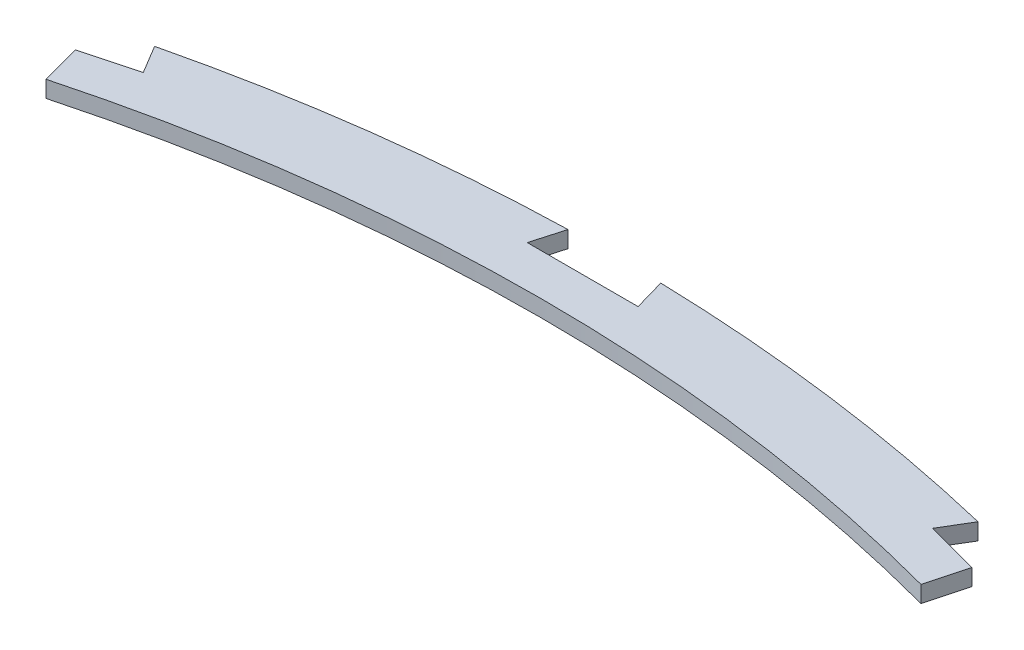
ISO-10303-21;
HEADER;
FILE_DESCRIPTION(('STEP AP214'),'2;1');
FILE_NAME('part.step','',(''),(''),'','','');
FILE_SCHEMA(('AUTOMOTIVE_DESIGN { 1 0 10303 214 1 1 1 1 }'));
ENDSEC;
DATA;
#1=APPLICATION_CONTEXT('core data for automotive mechanical design processes');
#2=APPLICATION_PROTOCOL_DEFINITION('international standard','automotive_design',2000,#1);
#3=PRODUCT_CONTEXT('',#1,'mechanical');
#4=PRODUCT('Part','Part','',(#3));
#5=PRODUCT_RELATED_PRODUCT_CATEGORY('part','',(#4));
#6=PRODUCT_DEFINITION_FORMATION('','',#4);
#7=PRODUCT_DEFINITION_CONTEXT('part definition',#1,'design');
#8=PRODUCT_DEFINITION('design','',#6,#7);
#9=PRODUCT_DEFINITION_SHAPE('','',#8);
#10=(LENGTH_UNIT() NAMED_UNIT(*) SI_UNIT(.MILLI.,.METRE.));
#11=(NAMED_UNIT(*) PLANE_ANGLE_UNIT() SI_UNIT($,.RADIAN.));
#12=(NAMED_UNIT(*) SI_UNIT($,.STERADIAN.) SOLID_ANGLE_UNIT());
#13=UNCERTAINTY_MEASURE_WITH_UNIT(LENGTH_MEASURE(1.E-05),#10,'distance_accuracy_value','');
#14=(GEOMETRIC_REPRESENTATION_CONTEXT(3) GLOBAL_UNCERTAINTY_ASSIGNED_CONTEXT((#13)) GLOBAL_UNIT_ASSIGNED_CONTEXT((#10,
#11,#12)) REPRESENTATION_CONTEXT('',''));
#15=CARTESIAN_POINT('',(0.,0.,0.));
#16=DIRECTION('',(0.,0.,1.));
#17=DIRECTION('',(1.,0.,0.));
#18=AXIS2_PLACEMENT_3D('',#15,#16,#17);
#19=CARTESIAN_POINT('',(0.,9.00000000000001,0.));
#20=DIRECTION('',(0.,-1.,0.));
#21=DIRECTION('',(0.,0.,-1.));
#22=AXIS2_PLACEMENT_3D('',#19,#20,#21);
#23=CYLINDRICAL_SURFACE('',#22,915.);
#24=CARTESIAN_POINT('',(0.,0.,0.));
#25=DIRECTION('',(0.,1.,0.));
#26=DIRECTION('',(0.,0.,1.));
#27=AXIS2_PLACEMENT_3D('',#24,#25,#26);
#28=CIRCLE('',#27,915.);
#29=CARTESIAN_POINT('',(236.819426268801,0.,-883.822131054499));
#30=VERTEX_POINT('',#29);
#31=CARTESIAN_POINT('',(-236.819426268801,0.,-883.822131054499));
#32=VERTEX_POINT('',#31);
#33=EDGE_CURVE('E172',#30,#32,#28,.T.);
#34=ORIENTED_EDGE('',*,*,#33,.F.);
#35=DIRECTION('',(0.,-1.,0.));
#36=VECTOR('',#35,1.);
#37=CARTESIAN_POINT('',(236.819426268801,9.00000000000001,-883.822131054499));
#38=LINE('',#37,#36);
#39=CARTESIAN_POINT('',(236.819426268801,9.00000000000001,-883.822131054499));
#40=VERTEX_POINT('',#39);
#41=EDGE_CURVE('E11',#40,#30,#38,.T.);
#42=ORIENTED_EDGE('',*,*,#41,.F.);
#43=CARTESIAN_POINT('',(0.,9.00000000000001,0.));
#44=DIRECTION('',(0.,1.,0.));
#45=DIRECTION('',(0.,0.,1.));
#46=AXIS2_PLACEMENT_3D('',#43,#44,#45);
#47=CIRCLE('',#46,915.);
#48=CARTESIAN_POINT('',(-236.819426268801,9.00000000000001,-883.822131054499));
#49=VERTEX_POINT('',#48);
#50=EDGE_CURVE('E209',#40,#49,#47,.T.);
#51=ORIENTED_EDGE('',*,*,#50,.T.);
#52=DIRECTION('',(0.,-1.,0.));
#53=VECTOR('',#52,1.);
#54=CARTESIAN_POINT('',(-236.819426268801,9.00000000000001,-883.822131054499));
#55=LINE('',#54,#53);
#56=EDGE_CURVE('E66',#49,#32,#55,.T.);
#57=ORIENTED_EDGE('',*,*,#56,.T.);
#58=EDGE_LOOP('',(#34,#42,#51,#57));
#59=FACE_BOUND('',#58,.T.);
#60=ADVANCED_FACE('F49',(#59),#23,.F.);
#61=CARTESIAN_POINT('',(0.,9.00000000000001,0.));
#62=DIRECTION('',(-0.96592582628907,0.,-0.258819045102515));
#63=DIRECTION('',(-0.258819045102515,0.,0.96592582628907));
#64=AXIS2_PLACEMENT_3D('',#61,#62,#63);
#65=PLANE('',#64);
#66=DIRECTION('',(0.258819045102515,0.,-0.96592582628907));
#67=VECTOR('',#66,1.);
#68=CARTESIAN_POINT('',(0.,0.,0.));
#69=LINE('',#68,#67);
#70=CARTESIAN_POINT('',(242.642854783607,0.,-905.555462146003));
#71=VERTEX_POINT('',#70);
#72=EDGE_CURVE('E175',#30,#71,#69,.T.);
#73=ORIENTED_EDGE('',*,*,#72,.T.);
#74=DIRECTION('',(0.,-1.,0.));
#75=VECTOR('',#74,1.);
#76=CARTESIAN_POINT('',(242.642854783607,9.00000000000001,-905.555462146003));
#77=LINE('',#76,#75);
#78=CARTESIAN_POINT('',(242.642854783607,9.00000000000001,-905.555462146003));
#79=VERTEX_POINT('',#78);
#80=EDGE_CURVE('E58',#79,#71,#77,.T.);
#81=ORIENTED_EDGE('',*,*,#80,.F.);
#82=DIRECTION('',(0.258819045102515,0.,-0.96592582628907));
#83=VECTOR('',#82,1.);
#84=CARTESIAN_POINT('',(0.,9.00000000000001,0.));
#85=LINE('',#84,#83);
#86=EDGE_CURVE('E438',#40,#79,#85,.T.);
#87=ORIENTED_EDGE('',*,*,#86,.F.);
#88=ORIENTED_EDGE('',*,*,#41,.T.);
#89=EDGE_LOOP('',(#73,#81,#87,#88));
#90=FACE_BOUND('',#89,.T.);
#91=ADVANCED_FACE('F310',(#90),#65,.F.);
#92=CARTESIAN_POINT('',(242.642854783606,9.00000000000001,-905.555462146003));
#93=DIRECTION('',(-0.258819045102514,0.,0.96592582628907));
#94=DIRECTION('',(0.96592582628907,0.,0.258819045102514));
#95=AXIS2_PLACEMENT_3D('',#92,#93,#94);
#96=PLANE('',#95);
#97=DIRECTION('',(-0.96592582628907,0.,-0.258819045102514));
#98=VECTOR('',#97,1.);
#99=CARTESIAN_POINT('',(242.642854783606,0.,-905.555462146003));
#100=LINE('',#99,#98);
#101=CARTESIAN_POINT('',(213.665079994935,0.,-913.320033499078));
#102=VERTEX_POINT('',#101);
#103=EDGE_CURVE('E178',#71,#102,#100,.T.);
#104=ORIENTED_EDGE('',*,*,#103,.T.);
#105=DIRECTION('',(0.,-1.,0.));
#106=VECTOR('',#105,1.);
#107=CARTESIAN_POINT('',(213.665079994935,9.00000000000001,-913.320033499078));
#108=LINE('',#107,#106);
#109=CARTESIAN_POINT('',(213.665079994935,9.00000000000001,-913.320033499078));
#110=VERTEX_POINT('',#109);
#111=EDGE_CURVE('E233',#110,#102,#108,.T.);
#112=ORIENTED_EDGE('',*,*,#111,.F.);
#113=DIRECTION('',(-0.96592582628907,0.,-0.258819045102514));
#114=VECTOR('',#113,1.);
#115=CARTESIAN_POINT('',(242.642854783606,9.00000000000001,-905.555462146003));
#116=LINE('',#115,#114);
#117=EDGE_CURVE('E245',#79,#110,#116,.T.);
#118=ORIENTED_EDGE('',*,*,#117,.F.);
#119=ORIENTED_EDGE('',*,*,#80,.T.);
#120=EDGE_LOOP('',(#104,#112,#118,#119));
#121=FACE_BOUND('',#120,.T.);
#122=ADVANCED_FACE('F243',(#121),#96,.F.);
#123=CARTESIAN_POINT('',(-245.630415407765,9.00000000000001,-147.271219979183));
#124=DIRECTION('',(-0.857657753629804,0.,-0.51422094243494));
#125=DIRECTION('',(-0.51422094243494,0.,0.857657753629804));
#126=AXIS2_PLACEMENT_3D('',#123,#124,#125);
#127=PLANE('',#126);
#128=DIRECTION('',(0.51422094243494,0.,-0.857657753629804));
#129=VECTOR('',#128,1.);
#130=CARTESIAN_POINT('',(-245.630415407765,0.,-147.271219979183));
#131=LINE('',#130,#129);
#132=CARTESIAN_POINT('',(222.847691179681,0.,-928.63550790172));
#133=VERTEX_POINT('',#132);
#134=EDGE_CURVE('E181',#102,#133,#131,.T.);
#135=ORIENTED_EDGE('',*,*,#134,.T.);
#136=DIRECTION('',(0.,-1.,0.));
#137=VECTOR('',#136,1.);
#138=CARTESIAN_POINT('',(222.847691179681,9.00000000000001,-928.63550790172));
#139=LINE('',#138,#137);
#140=CARTESIAN_POINT('',(222.847691179681,9.00000000000001,-928.63550790172));
#141=VERTEX_POINT('',#140);
#142=EDGE_CURVE('E229',#141,#133,#139,.T.);
#143=ORIENTED_EDGE('',*,*,#142,.F.);
#144=DIRECTION('',(0.51422094243494,0.,-0.857657753629804));
#145=VECTOR('',#144,1.);
#146=CARTESIAN_POINT('',(-245.630415407765,9.00000000000001,-147.271219979183));
#147=LINE('',#146,#145);
#148=EDGE_CURVE('E265',#110,#141,#147,.T.);
#149=ORIENTED_EDGE('',*,*,#148,.F.);
#150=ORIENTED_EDGE('',*,*,#111,.T.);
#151=EDGE_LOOP('',(#135,#143,#149,#150));
#152=FACE_BOUND('',#151,.T.);
#153=ADVANCED_FACE('F254',(#152),#127,.F.);
#154=CARTESIAN_POINT('',(0.,9.00000000000001,0.));
#155=DIRECTION('',(0.,-1.,0.));
#156=DIRECTION('',(0.,0.,-1.));
#157=AXIS2_PLACEMENT_3D('',#154,#155,#156);
#158=CYLINDRICAL_SURFACE('',#157,955.);
#159=CARTESIAN_POINT('',(0.,0.,0.));
#160=DIRECTION('',(0.,1.,0.));
#161=DIRECTION('',(0.,0.,1.));
#162=AXIS2_PLACEMENT_3D('',#159,#160,#161);
#163=CIRCLE('',#162,955.);
#164=CARTESIAN_POINT('',(25.0942151640675,0.,-954.670246925764));
#165=VERTEX_POINT('',#164);
#166=EDGE_CURVE('E184',#133,#165,#163,.T.);
#167=ORIENTED_EDGE('',*,*,#166,.T.);
#168=DIRECTION('',(0.,-1.,0.));
#169=VECTOR('',#168,1.);
#170=CARTESIAN_POINT('',(25.0942151640675,9.00000000000001,-954.670246925764));
#171=LINE('',#170,#169);
#172=CARTESIAN_POINT('',(25.0942151640675,9.00000000000001,-954.670246925764));
#173=VERTEX_POINT('',#172);
#174=EDGE_CURVE('E226',#173,#165,#171,.T.);
#175=ORIENTED_EDGE('',*,*,#174,.F.);
#176=CARTESIAN_POINT('',(0.,9.00000000000001,0.));
#177=DIRECTION('',(0.,1.,0.));
#178=DIRECTION('',(0.,0.,1.));
#179=AXIS2_PLACEMENT_3D('',#176,#177,#178);
#180=CIRCLE('',#179,955.);
#181=EDGE_CURVE('E260',#141,#173,#180,.T.);
#182=ORIENTED_EDGE('',*,*,#181,.F.);
#183=ORIENTED_EDGE('',*,*,#142,.T.);
#184=EDGE_LOOP('',(#167,#175,#182,#183));
#185=FACE_BOUND('',#184,.T.);
#186=ADVANCED_FACE('F258',(#185),#158,.T.);
#187=CARTESIAN_POINT('',(275.377358490566,9.00000000000001,-78.6792452830185));
#188=DIRECTION('',(-0.961523947640823,0.,0.274721127897378));
#189=DIRECTION('',(0.274721127897378,0.,0.961523947640823));
#190=AXIS2_PLACEMENT_3D('',#187,#188,#189);
#191=PLANE('',#190);
#192=DIRECTION('',(-0.274721127897378,0.,-0.961523947640823));
#193=VECTOR('',#192,1.);
#194=CARTESIAN_POINT('',(275.377358490566,0.,-78.6792452830185));
#195=LINE('',#194,#193);
#196=CARTESIAN_POINT('',(30.,0.,-937.5));
#197=VERTEX_POINT('',#196);
#198=EDGE_CURVE('E188',#197,#165,#195,.T.);
#199=ORIENTED_EDGE('',*,*,#198,.F.);
#200=DIRECTION('',(0.,-1.,0.));
#201=VECTOR('',#200,1.);
#202=CARTESIAN_POINT('',(30.,9.00000000000001,-937.5));
#203=LINE('',#202,#201);
#204=CARTESIAN_POINT('',(30.,9.00000000000001,-937.5));
#205=VERTEX_POINT('',#204);
#206=EDGE_CURVE('E223',#205,#197,#203,.T.);
#207=ORIENTED_EDGE('',*,*,#206,.F.);
#208=DIRECTION('',(-0.274721127897378,0.,-0.961523947640823));
#209=VECTOR('',#208,1.);
#210=CARTESIAN_POINT('',(275.377358490566,9.00000000000001,-78.6792452830185));
#211=LINE('',#210,#209);
#212=EDGE_CURVE('E264',#205,#173,#211,.T.);
#213=ORIENTED_EDGE('',*,*,#212,.T.);
#214=ORIENTED_EDGE('',*,*,#174,.T.);
#215=EDGE_LOOP('',(#199,#207,#213,#214));
#216=FACE_BOUND('',#215,.T.);
#217=ADVANCED_FACE('F290',(#216),#191,.T.);
#218=CARTESIAN_POINT('',(0.,9.00000000000001,-937.5));
#219=DIRECTION('',(0.,0.,-1.));
#220=DIRECTION('',(-1.,0.,0.));
#221=AXIS2_PLACEMENT_3D('',#218,#219,#220);
#222=PLANE('',#221);
#223=DIRECTION('',(1.,0.,0.));
#224=VECTOR('',#223,1.);
#225=CARTESIAN_POINT('',(0.,0.,-937.5));
#226=LINE('',#225,#224);
#227=CARTESIAN_POINT('',(-30.,0.,-937.5));
#228=VERTEX_POINT('',#227);
#229=EDGE_CURVE('E193',#228,#197,#226,.T.);
#230=ORIENTED_EDGE('',*,*,#229,.F.);
#231=DIRECTION('',(0.,-1.,0.));
#232=VECTOR('',#231,1.);
#233=CARTESIAN_POINT('',(-30.,9.00000000000001,-937.5));
#234=LINE('',#233,#232);
#235=CARTESIAN_POINT('',(-30.,9.00000000000001,-937.5));
#236=VERTEX_POINT('',#235);
#237=EDGE_CURVE('E220',#236,#228,#234,.T.);
#238=ORIENTED_EDGE('',*,*,#237,.F.);
#239=DIRECTION('',(1.,0.,0.));
#240=VECTOR('',#239,1.);
#241=CARTESIAN_POINT('',(0.,9.00000000000001,-937.5));
#242=LINE('',#241,#240);
#243=EDGE_CURVE('E270',#236,#205,#242,.T.);
#244=ORIENTED_EDGE('',*,*,#243,.T.);
#245=ORIENTED_EDGE('',*,*,#206,.T.);
#246=EDGE_LOOP('',(#230,#238,#244,#245));
#247=FACE_BOUND('',#246,.T.);
#248=ADVANCED_FACE('F287',(#247),#222,.T.);
#249=CARTESIAN_POINT('',(-275.377358490566,9.00000000000001,-78.6792452830185));
#250=DIRECTION('',(-0.961523947640823,0.,-0.274721127897378));
#251=DIRECTION('',(-0.274721127897378,0.,0.961523947640823));
#252=AXIS2_PLACEMENT_3D('',#249,#250,#251);
#253=PLANE('',#252);
#254=DIRECTION('',(0.274721127897378,0.,-0.961523947640823));
#255=VECTOR('',#254,1.);
#256=CARTESIAN_POINT('',(-275.377358490566,0.,-78.6792452830185));
#257=LINE('',#256,#255);
#258=CARTESIAN_POINT('',(-25.0942151640675,0.,-954.670246925764));
#259=VERTEX_POINT('',#258);
#260=EDGE_CURVE('E197',#228,#259,#257,.T.);
#261=ORIENTED_EDGE('',*,*,#260,.T.);
#262=DIRECTION('',(0.,-1.,0.));
#263=VECTOR('',#262,1.);
#264=CARTESIAN_POINT('',(-25.0942151640675,9.00000000000001,-954.670246925764));
#265=LINE('',#264,#263);
#266=CARTESIAN_POINT('',(-25.0942151640675,9.00000000000001,-954.670246925764));
#267=VERTEX_POINT('',#266);
#268=EDGE_CURVE('E216',#267,#259,#265,.T.);
#269=ORIENTED_EDGE('',*,*,#268,.F.);
#270=DIRECTION('',(0.274721127897378,0.,-0.961523947640823));
#271=VECTOR('',#270,1.);
#272=CARTESIAN_POINT('',(-275.377358490566,9.00000000000001,-78.6792452830185));
#273=LINE('',#272,#271);
#274=EDGE_CURVE('E274',#236,#267,#273,.T.);
#275=ORIENTED_EDGE('',*,*,#274,.F.);
#276=ORIENTED_EDGE('',*,*,#237,.T.);
#277=EDGE_LOOP('',(#261,#269,#275,#276));
#278=FACE_BOUND('',#277,.T.);
#279=ADVANCED_FACE('F295',(#278),#253,.F.);
#280=CARTESIAN_POINT('',(-222.847691179681,0.,-928.63550790172));
#281=VERTEX_POINT('',#280);
#282=EDGE_CURVE('E189',#259,#281,#163,.T.);
#283=ORIENTED_EDGE('',*,*,#282,.T.);
#284=DIRECTION('',(0.,-1.,0.));
#285=VECTOR('',#284,1.);
#286=CARTESIAN_POINT('',(-222.847691179681,9.00000000000001,-928.63550790172));
#287=LINE('',#286,#285);
#288=CARTESIAN_POINT('',(-222.847691179681,9.00000000000001,-928.63550790172));
#289=VERTEX_POINT('',#288);
#290=EDGE_CURVE('E150',#289,#281,#287,.T.);
#291=ORIENTED_EDGE('',*,*,#290,.F.);
#292=EDGE_CURVE('E159',#267,#289,#180,.T.);
#293=ORIENTED_EDGE('',*,*,#292,.F.);
#294=ORIENTED_EDGE('',*,*,#268,.T.);
#295=EDGE_LOOP('',(#283,#291,#293,#294));
#296=FACE_BOUND('',#295,.T.);
#297=ADVANCED_FACE('F297',(#296),#158,.T.);
#298=CARTESIAN_POINT('',(245.630415407765,9.00000000000001,-147.271219979183));
#299=DIRECTION('',(-0.857657753629804,0.,0.51422094243494));
#300=DIRECTION('',(0.51422094243494,0.,0.857657753629804));
#301=AXIS2_PLACEMENT_3D('',#298,#299,#300);
#302=PLANE('',#301);
#303=DIRECTION('',(-0.51422094243494,0.,-0.857657753629804));
#304=VECTOR('',#303,1.);
#305=CARTESIAN_POINT('',(245.630415407765,0.,-147.271219979183));
#306=LINE('',#305,#304);
#307=CARTESIAN_POINT('',(-213.665079994935,0.,-913.320033499078));
#308=VERTEX_POINT('',#307);
#309=EDGE_CURVE('E145',#308,#281,#306,.T.);
#310=ORIENTED_EDGE('',*,*,#309,.F.);
#311=DIRECTION('',(0.,-1.,0.));
#312=VECTOR('',#311,1.);
#313=CARTESIAN_POINT('',(-213.665079994935,9.00000000000001,-913.320033499078));
#314=LINE('',#313,#312);
#315=CARTESIAN_POINT('',(-213.665079994935,9.00000000000001,-913.320033499078));
#316=VERTEX_POINT('',#315);
#317=EDGE_CURVE('E140',#316,#308,#314,.T.);
#318=ORIENTED_EDGE('',*,*,#317,.F.);
#319=DIRECTION('',(-0.51422094243494,0.,-0.857657753629804));
#320=VECTOR('',#319,1.);
#321=CARTESIAN_POINT('',(245.630415407765,9.00000000000001,-147.271219979183));
#322=LINE('',#321,#320);
#323=EDGE_CURVE('E143',#316,#289,#322,.T.);
#324=ORIENTED_EDGE('',*,*,#323,.T.);
#325=ORIENTED_EDGE('',*,*,#290,.T.);
#326=EDGE_LOOP('',(#310,#318,#324,#325));
#327=FACE_BOUND('',#326,.T.);
#328=ADVANCED_FACE('F142',(#327),#302,.T.);
#329=CARTESIAN_POINT('',(-242.642854783606,9.00000000000001,-905.555462146003));
#330=DIRECTION('',(-0.258819045102514,0.,-0.96592582628907));
#331=DIRECTION('',(-0.96592582628907,0.,0.258819045102514));
#332=AXIS2_PLACEMENT_3D('',#329,#330,#331);
#333=PLANE('',#332);
#334=DIRECTION('',(0.96592582628907,0.,-0.258819045102514));
#335=VECTOR('',#334,1.);
#336=CARTESIAN_POINT('',(-242.642854783606,0.,-905.555462146003));
#337=LINE('',#336,#335);
#338=CARTESIAN_POINT('',(-242.642854783607,0.,-905.555462146003));
#339=VERTEX_POINT('',#338);
#340=EDGE_CURVE('E202',#339,#308,#337,.T.);
#341=ORIENTED_EDGE('',*,*,#340,.F.);
#342=DIRECTION('',(0.,-1.,0.));
#343=VECTOR('',#342,1.);
#344=CARTESIAN_POINT('',(-242.642854783607,9.00000000000001,-905.555462146003));
#345=LINE('',#344,#343);
#346=CARTESIAN_POINT('',(-242.642854783607,9.00000000000001,-905.555462146003));
#347=VERTEX_POINT('',#346);
#348=EDGE_CURVE('E103',#347,#339,#345,.T.);
#349=ORIENTED_EDGE('',*,*,#348,.F.);
#350=DIRECTION('',(0.96592582628907,0.,-0.258819045102514));
#351=VECTOR('',#350,1.);
#352=CARTESIAN_POINT('',(-242.642854783606,9.00000000000001,-905.555462146003));
#353=LINE('',#352,#351);
#354=EDGE_CURVE('E157',#347,#316,#353,.T.);
#355=ORIENTED_EDGE('',*,*,#354,.T.);
#356=ORIENTED_EDGE('',*,*,#317,.T.);
#357=EDGE_LOOP('',(#341,#349,#355,#356));
#358=FACE_BOUND('',#357,.T.);
#359=ADVANCED_FACE('F163',(#358),#333,.T.);
#360=CARTESIAN_POINT('',(0.,9.00000000000001,0.));
#361=DIRECTION('',(-0.96592582628907,0.,0.258819045102515));
#362=DIRECTION('',(0.258819045102515,0.,0.96592582628907));
#363=AXIS2_PLACEMENT_3D('',#360,#361,#362);
#364=PLANE('',#363);
#365=DIRECTION('',(-0.258819045102515,0.,-0.96592582628907));
#366=VECTOR('',#365,1.);
#367=CARTESIAN_POINT('',(0.,0.,0.));
#368=LINE('',#367,#366);
#369=EDGE_CURVE('E205',#32,#339,#368,.T.);
#370=ORIENTED_EDGE('',*,*,#369,.F.);
#371=ORIENTED_EDGE('',*,*,#56,.F.);
#372=DIRECTION('',(-0.258819045102515,0.,-0.96592582628907));
#373=VECTOR('',#372,1.);
#374=CARTESIAN_POINT('',(0.,9.00000000000001,0.));
#375=LINE('',#374,#373);
#376=EDGE_CURVE('E165',#49,#347,#375,.T.);
#377=ORIENTED_EDGE('',*,*,#376,.T.);
#378=ORIENTED_EDGE('',*,*,#348,.T.);
#379=EDGE_LOOP('',(#370,#371,#377,#378));
#380=FACE_BOUND('',#379,.T.);
#381=ADVANCED_FACE('F299',(#380),#364,.T.);
#382=CARTESIAN_POINT('',(0.,9.00000000000001,0.));
#383=DIRECTION('',(0.,1.,0.));
#384=DIRECTION('',(0.,0.,1.));
#385=AXIS2_PLACEMENT_3D('',#382,#383,#384);
#386=PLANE('',#385);
#387=ORIENTED_EDGE('',*,*,#50,.F.);
#388=ORIENTED_EDGE('',*,*,#86,.T.);
#389=ORIENTED_EDGE('',*,*,#117,.T.);
#390=ORIENTED_EDGE('',*,*,#148,.T.);
#391=ORIENTED_EDGE('',*,*,#181,.T.);
#392=ORIENTED_EDGE('',*,*,#212,.F.);
#393=ORIENTED_EDGE('',*,*,#243,.F.);
#394=ORIENTED_EDGE('',*,*,#274,.T.);
#395=ORIENTED_EDGE('',*,*,#292,.T.);
#396=ORIENTED_EDGE('',*,*,#323,.F.);
#397=ORIENTED_EDGE('',*,*,#354,.F.);
#398=ORIENTED_EDGE('',*,*,#376,.F.);
#399=EDGE_LOOP('',(#387,#388,#389,#390,#391,#392,#393,#394,#395,#396,#397,#398));
#400=FACE_BOUND('',#399,.T.);
#401=ADVANCED_FACE('F155',(#400),#386,.T.);
#402=CARTESIAN_POINT('',(0.,0.,0.));
#403=DIRECTION('',(0.,1.,0.));
#404=DIRECTION('',(0.,0.,1.));
#405=AXIS2_PLACEMENT_3D('',#402,#403,#404);
#406=PLANE('',#405);
#407=ORIENTED_EDGE('',*,*,#33,.T.);
#408=ORIENTED_EDGE('',*,*,#369,.T.);
#409=ORIENTED_EDGE('',*,*,#340,.T.);
#410=ORIENTED_EDGE('',*,*,#309,.T.);
#411=ORIENTED_EDGE('',*,*,#282,.F.);
#412=ORIENTED_EDGE('',*,*,#260,.F.);
#413=ORIENTED_EDGE('',*,*,#229,.T.);
#414=ORIENTED_EDGE('',*,*,#198,.T.);
#415=ORIENTED_EDGE('',*,*,#166,.F.);
#416=ORIENTED_EDGE('',*,*,#134,.F.);
#417=ORIENTED_EDGE('',*,*,#103,.F.);
#418=ORIENTED_EDGE('',*,*,#72,.F.);
#419=EDGE_LOOP('',(#407,#408,#409,#410,#411,#412,#413,#414,#415,#416,#417,#418));
#420=FACE_BOUND('',#419,.T.);
#421=ADVANCED_FACE('F250',(#420),#406,.F.);
#422=CLOSED_SHELL('',(#60,#91,#122,#153,#186,#217,#248,#279,#297,#328,#359,#381,#401,#421));
#423=MANIFOLD_SOLID_BREP('B2',#422);
#424=ADVANCED_BREP_SHAPE_REPRESENTATION('',(#18,#423),#14);
#425=SHAPE_DEFINITION_REPRESENTATION(#9,#424);
ENDSEC;
END-ISO-10303-21;
